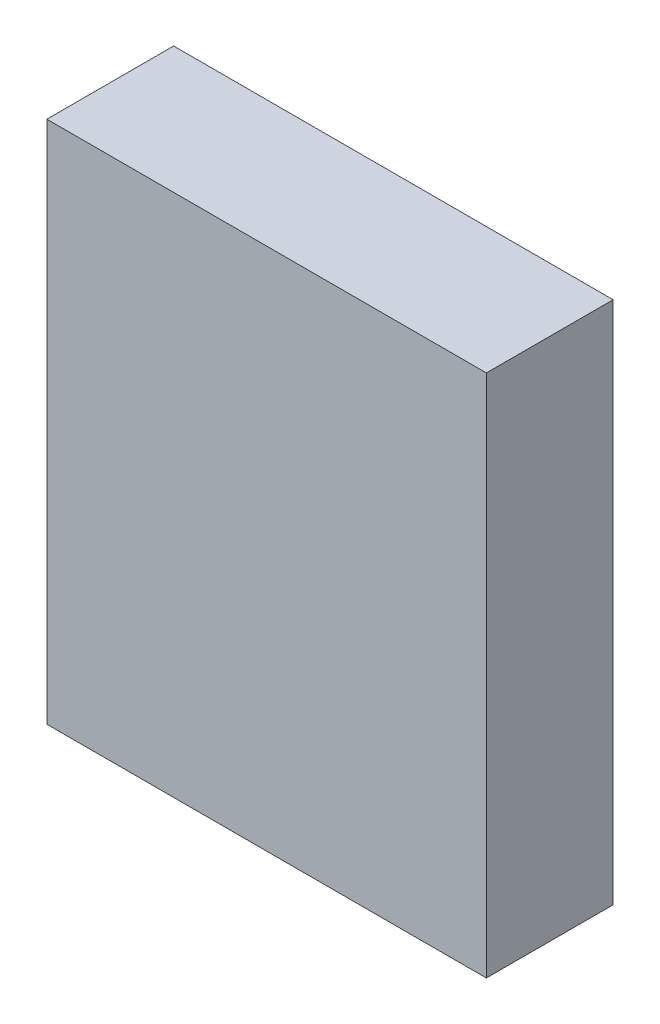
ISO-10303-21;
HEADER;
FILE_DESCRIPTION(('STEP AP214'),'2;1');
FILE_NAME('part.step','',(''),(''),'','','');
FILE_SCHEMA(('AUTOMOTIVE_DESIGN { 1 0 10303 214 1 1 1 1 }'));
ENDSEC;
DATA;
#1=APPLICATION_CONTEXT('core data for automotive mechanical design processes');
#2=APPLICATION_PROTOCOL_DEFINITION('international standard','automotive_design',2000,#1);
#3=PRODUCT_CONTEXT('',#1,'mechanical');
#4=PRODUCT('Part','Part','',(#3));
#5=PRODUCT_RELATED_PRODUCT_CATEGORY('part','',(#4));
#6=PRODUCT_DEFINITION_FORMATION('','',#4);
#7=PRODUCT_DEFINITION_CONTEXT('part definition',#1,'design');
#8=PRODUCT_DEFINITION('design','',#6,#7);
#9=PRODUCT_DEFINITION_SHAPE('','',#8);
#10=(LENGTH_UNIT() NAMED_UNIT(*) SI_UNIT(.MILLI.,.METRE.));
#11=(NAMED_UNIT(*) PLANE_ANGLE_UNIT() SI_UNIT($,.RADIAN.));
#12=(NAMED_UNIT(*) SI_UNIT($,.STERADIAN.) SOLID_ANGLE_UNIT());
#13=UNCERTAINTY_MEASURE_WITH_UNIT(LENGTH_MEASURE(1.E-05),#10,'distance_accuracy_value','');
#14=(GEOMETRIC_REPRESENTATION_CONTEXT(3) GLOBAL_UNCERTAINTY_ASSIGNED_CONTEXT((#13)) GLOBAL_UNIT_ASSIGNED_CONTEXT((#10,
#11,#12)) REPRESENTATION_CONTEXT('',''));
#15=CARTESIAN_POINT('',(0.,0.,0.));
#16=DIRECTION('',(0.,0.,1.));
#17=DIRECTION('',(1.,0.,0.));
#18=AXIS2_PLACEMENT_3D('',#15,#16,#17);
#19=CARTESIAN_POINT('',(2.59999988,-3.09999888,1.49999954));
#20=DIRECTION('',(0.,0.,1.));
#21=DIRECTION('',(1.,0.,0.));
#22=AXIS2_PLACEMENT_3D('',#19,#20,#21);
#23=PLANE('',#22);
#24=DIRECTION('',(0.,1.,0.));
#25=VECTOR('',#24,1.);
#26=CARTESIAN_POINT('',(-2.59999988,-3.09999888,1.49999954));
#27=LINE('',#26,#25);
#28=CARTESIAN_POINT('',(-2.59999988,-3.09999888,1.49999954));
#29=VERTEX_POINT('',#28);
#30=CARTESIAN_POINT('',(-2.59999988,3.10000142,1.49999954));
#31=VERTEX_POINT('',#30);
#32=EDGE_CURVE('E52',#29,#31,#27,.T.);
#33=ORIENTED_EDGE('',*,*,#32,.F.);
#34=DIRECTION('',(1.,0.,0.));
#35=VECTOR('',#34,1.);
#36=CARTESIAN_POINT('',(2.59999988,-3.09999888,1.49999954));
#37=LINE('',#36,#35);
#38=CARTESIAN_POINT('',(2.59999988,-3.09999888,1.49999954));
#39=VERTEX_POINT('',#38);
#40=EDGE_CURVE('E67',#39,#29,#37,.F.);
#41=ORIENTED_EDGE('',*,*,#40,.F.);
#42=DIRECTION('',(0.,1.,0.));
#43=VECTOR('',#42,1.);
#44=CARTESIAN_POINT('',(2.59999988,3.10000142,1.49999954));
#45=LINE('',#44,#43);
#46=CARTESIAN_POINT('',(2.59999988,3.10000142,1.49999954));
#47=VERTEX_POINT('',#46);
#48=EDGE_CURVE('E19',#47,#39,#45,.F.);
#49=ORIENTED_EDGE('',*,*,#48,.F.);
#50=DIRECTION('',(1.,0.,0.));
#51=VECTOR('',#50,1.);
#52=CARTESIAN_POINT('',(-2.59999988,3.10000142,1.49999954));
#53=LINE('',#52,#51);
#54=EDGE_CURVE('E57',#31,#47,#53,.T.);
#55=ORIENTED_EDGE('',*,*,#54,.F.);
#56=EDGE_LOOP('',(#33,#41,#49,#55));
#57=FACE_BOUND('',#56,.T.);
#58=ADVANCED_FACE('F16',(#57),#23,.T.);
#59=CARTESIAN_POINT('',(2.59999988,3.10000142,0.));
#60=DIRECTION('',(1.,0.,0.));
#61=DIRECTION('',(0.,0.,-1.));
#62=AXIS2_PLACEMENT_3D('',#59,#60,#61);
#63=PLANE('',#62);
#64=DIRECTION('',(0.,0.,-1.));
#65=VECTOR('',#64,1.);
#66=CARTESIAN_POINT('',(2.59999988,-3.09999888,0.));
#67=LINE('',#66,#65);
#68=CARTESIAN_POINT('',(2.59999988,-3.09999888,0.));
#69=VERTEX_POINT('',#68);
#70=EDGE_CURVE('E78',#69,#39,#67,.F.);
#71=ORIENTED_EDGE('',*,*,#70,.F.);
#72=DIRECTION('',(0.,1.,0.));
#73=VECTOR('',#72,1.);
#74=CARTESIAN_POINT('',(2.59999988,-3.09999888,0.));
#75=LINE('',#74,#73);
#76=CARTESIAN_POINT('',(2.59999988,3.10000142,0.));
#77=VERTEX_POINT('',#76);
#78=EDGE_CURVE('E73',#69,#77,#75,.T.);
#79=ORIENTED_EDGE('',*,*,#78,.T.);
#80=DIRECTION('',(0.,0.,1.));
#81=VECTOR('',#80,1.);
#82=CARTESIAN_POINT('',(2.59999988,3.10000142,0.));
#83=LINE('',#82,#81);
#84=EDGE_CURVE('E62',#47,#77,#83,.F.);
#85=ORIENTED_EDGE('',*,*,#84,.F.);
#86=ORIENTED_EDGE('',*,*,#48,.T.);
#87=EDGE_LOOP('',(#71,#79,#85,#86));
#88=FACE_BOUND('',#87,.T.);
#89=ADVANCED_FACE('F72',(#88),#63,.T.);
#90=CARTESIAN_POINT('',(-2.59999988,3.10000142,0.));
#91=DIRECTION('',(0.,1.,0.));
#92=DIRECTION('',(0.,0.,1.));
#93=AXIS2_PLACEMENT_3D('',#90,#91,#92);
#94=PLANE('',#93);
#95=ORIENTED_EDGE('',*,*,#84,.T.);
#96=DIRECTION('',(1.,0.,0.));
#97=VECTOR('',#96,1.);
#98=CARTESIAN_POINT('',(2.59999988,3.10000142,0.));
#99=LINE('',#98,#97);
#100=CARTESIAN_POINT('',(-2.59999988,3.10000142,0.));
#101=VERTEX_POINT('',#100);
#102=EDGE_CURVE('E83',#77,#101,#99,.F.);
#103=ORIENTED_EDGE('',*,*,#102,.T.);
#104=DIRECTION('',(0.,0.,1.));
#105=VECTOR('',#104,1.);
#106=CARTESIAN_POINT('',(-2.59999988,3.10000142,0.));
#107=LINE('',#106,#105);
#108=EDGE_CURVE('E64',#31,#101,#107,.F.);
#109=ORIENTED_EDGE('',*,*,#108,.F.);
#110=ORIENTED_EDGE('',*,*,#54,.T.);
#111=EDGE_LOOP('',(#95,#103,#109,#110));
#112=FACE_BOUND('',#111,.T.);
#113=ADVANCED_FACE('F59',(#112),#94,.T.);
#114=CARTESIAN_POINT('',(-2.59999988,-3.09999888,0.));
#115=DIRECTION('',(-1.,0.,0.));
#116=DIRECTION('',(0.,0.,1.));
#117=AXIS2_PLACEMENT_3D('',#114,#115,#116);
#118=PLANE('',#117);
#119=ORIENTED_EDGE('',*,*,#108,.T.);
#120=DIRECTION('',(0.,1.,0.));
#121=VECTOR('',#120,1.);
#122=CARTESIAN_POINT('',(-2.59999988,-3.09999888,0.));
#123=LINE('',#122,#121);
#124=CARTESIAN_POINT('',(-2.59999988,-3.09999888,0.));
#125=VERTEX_POINT('',#124);
#126=EDGE_CURVE('E25',#101,#125,#123,.F.);
#127=ORIENTED_EDGE('',*,*,#126,.T.);
#128=DIRECTION('',(0.,0.,-1.));
#129=VECTOR('',#128,1.);
#130=CARTESIAN_POINT('',(-2.59999988,-3.09999888,0.));
#131=LINE('',#130,#129);
#132=EDGE_CURVE('E33',#29,#125,#131,.T.);
#133=ORIENTED_EDGE('',*,*,#132,.F.);
#134=ORIENTED_EDGE('',*,*,#32,.T.);
#135=EDGE_LOOP('',(#119,#127,#133,#134));
#136=FACE_BOUND('',#135,.T.);
#137=ADVANCED_FACE('F87',(#136),#118,.T.);
#138=CARTESIAN_POINT('',(2.59999988,-3.09999888,0.));
#139=DIRECTION('',(0.,-1.,0.));
#140=DIRECTION('',(0.,0.,-1.));
#141=AXIS2_PLACEMENT_3D('',#138,#139,#140);
#142=PLANE('',#141);
#143=ORIENTED_EDGE('',*,*,#132,.T.);
#144=DIRECTION('',(1.,0.,0.));
#145=VECTOR('',#144,1.);
#146=CARTESIAN_POINT('',(2.59999988,-3.09999888,0.));
#147=LINE('',#146,#145);
#148=EDGE_CURVE('E11',#125,#69,#147,.T.);
#149=ORIENTED_EDGE('',*,*,#148,.T.);
#150=ORIENTED_EDGE('',*,*,#70,.T.);
#151=ORIENTED_EDGE('',*,*,#40,.T.);
#152=EDGE_LOOP('',(#143,#149,#150,#151));
#153=FACE_BOUND('',#152,.T.);
#154=ADVANCED_FACE('F90',(#153),#142,.T.);
#155=CARTESIAN_POINT('',(2.59999988,-3.09999888,0.));
#156=DIRECTION('',(0.,0.,1.));
#157=DIRECTION('',(1.,0.,0.));
#158=AXIS2_PLACEMENT_3D('',#155,#156,#157);
#159=PLANE('',#158);
#160=ORIENTED_EDGE('',*,*,#126,.F.);
#161=ORIENTED_EDGE('',*,*,#102,.F.);
#162=ORIENTED_EDGE('',*,*,#78,.F.);
#163=ORIENTED_EDGE('',*,*,#148,.F.);
#164=EDGE_LOOP('',(#160,#161,#162,#163));
#165=FACE_BOUND('',#164,.T.);
#166=ADVANCED_FACE('F89',(#165),#159,.F.);
#167=CLOSED_SHELL('',(#58,#89,#113,#137,#154,#166));
#168=MANIFOLD_SOLID_BREP('B1',#167);
#169=ADVANCED_BREP_SHAPE_REPRESENTATION('',(#18,#168),#14);
#170=SHAPE_DEFINITION_REPRESENTATION(#9,#169);
ENDSEC;
END-ISO-10303-21;
